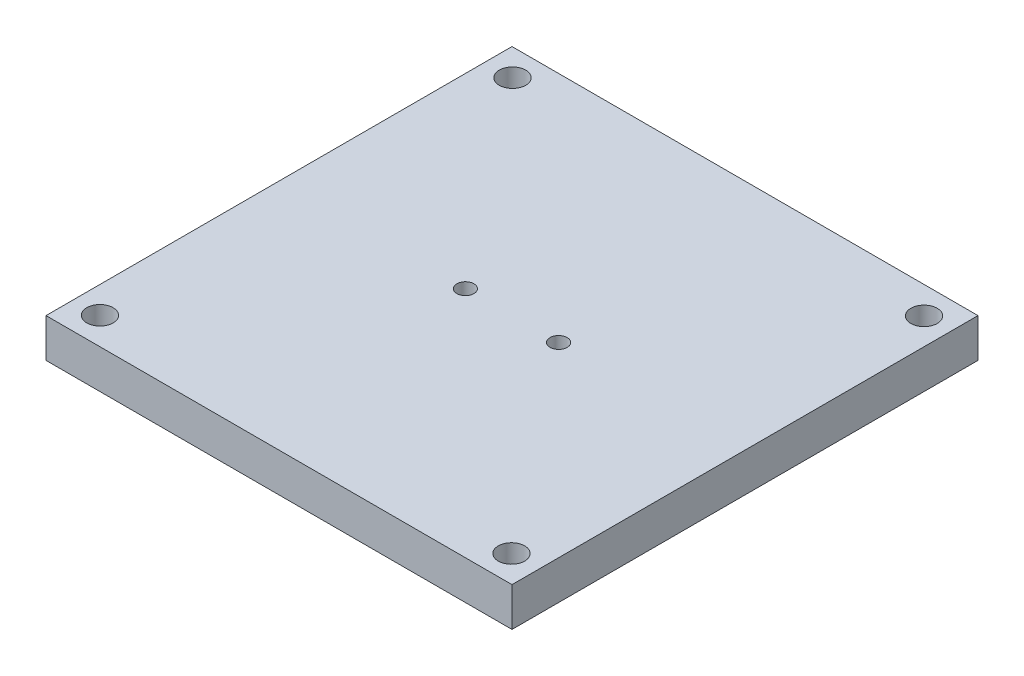
ISO-10303-21;
HEADER;
FILE_DESCRIPTION(('STEP AP214'),'2;1');
FILE_NAME('part.step','',(''),(''),'','','');
FILE_SCHEMA(('AUTOMOTIVE_DESIGN { 1 0 10303 214 1 1 1 1 }'));
ENDSEC;
DATA;
#1=APPLICATION_CONTEXT('core data for automotive mechanical design processes');
#2=APPLICATION_PROTOCOL_DEFINITION('international standard','automotive_design',2000,#1);
#3=PRODUCT_CONTEXT('',#1,'mechanical');
#4=PRODUCT('Part','Part','',(#3));
#5=PRODUCT_RELATED_PRODUCT_CATEGORY('part','',(#4));
#6=PRODUCT_DEFINITION_FORMATION('','',#4);
#7=PRODUCT_DEFINITION_CONTEXT('part definition',#1,'design');
#8=PRODUCT_DEFINITION('design','',#6,#7);
#9=PRODUCT_DEFINITION_SHAPE('','',#8);
#10=(LENGTH_UNIT() NAMED_UNIT(*) SI_UNIT(.MILLI.,.METRE.));
#11=(NAMED_UNIT(*) PLANE_ANGLE_UNIT() SI_UNIT($,.RADIAN.));
#12=(NAMED_UNIT(*) SI_UNIT($,.STERADIAN.) SOLID_ANGLE_UNIT());
#13=UNCERTAINTY_MEASURE_WITH_UNIT(LENGTH_MEASURE(1.E-05),#10,'distance_accuracy_value','');
#14=(GEOMETRIC_REPRESENTATION_CONTEXT(3) GLOBAL_UNCERTAINTY_ASSIGNED_CONTEXT((#13)) GLOBAL_UNIT_ASSIGNED_CONTEXT((#10,
#11,#12)) REPRESENTATION_CONTEXT('',''));
#15=CARTESIAN_POINT('',(0.,0.,0.));
#16=DIRECTION('',(0.,0.,1.));
#17=DIRECTION('',(1.,0.,0.));
#18=AXIS2_PLACEMENT_3D('',#15,#16,#17);
#19=CARTESIAN_POINT('',(0.,5.,0.));
#20=DIRECTION('',(0.,-1.,0.));
#21=DIRECTION('',(0.,0.,-1.));
#22=AXIS2_PLACEMENT_3D('',#19,#20,#21);
#23=PLANE('',#22);
#24=DIRECTION('',(0.,0.,1.));
#25=VECTOR('',#24,1.);
#26=CARTESIAN_POINT('',(0.,5.,0.));
#27=LINE('',#26,#25);
#28=CARTESIAN_POINT('',(0.,5.,-60.));
#29=VERTEX_POINT('',#28);
#30=CARTESIAN_POINT('',(0.,5.,0.));
#31=VERTEX_POINT('',#30);
#32=EDGE_CURVE('E93',#29,#31,#27,.T.);
#33=ORIENTED_EDGE('',*,*,#32,.T.);
#34=DIRECTION('',(1.,0.,0.));
#35=VECTOR('',#34,1.);
#36=CARTESIAN_POINT('',(0.,5.,0.));
#37=LINE('',#36,#35);
#38=CARTESIAN_POINT('',(60.,5.,0.));
#39=VERTEX_POINT('',#38);
#40=EDGE_CURVE('E88',#31,#39,#37,.T.);
#41=ORIENTED_EDGE('',*,*,#40,.T.);
#42=DIRECTION('',(0.,0.,-1.));
#43=VECTOR('',#42,1.);
#44=CARTESIAN_POINT('',(60.,5.,0.));
#45=LINE('',#44,#43);
#46=CARTESIAN_POINT('',(60.,5.,-60.));
#47=VERTEX_POINT('',#46);
#48=EDGE_CURVE('E91',#39,#47,#45,.T.);
#49=ORIENTED_EDGE('',*,*,#48,.T.);
#50=DIRECTION('',(-1.,0.,0.));
#51=VECTOR('',#50,1.);
#52=CARTESIAN_POINT('',(0.,5.,-60.));
#53=LINE('',#52,#51);
#54=EDGE_CURVE('E58',#47,#29,#53,.T.);
#55=ORIENTED_EDGE('',*,*,#54,.T.);
#56=EDGE_LOOP('',(#33,#41,#49,#55));
#57=FACE_BOUND('',#56,.T.);
#58=CARTESIAN_POINT('',(36.,5.,-30.));
#59=DIRECTION('',(0.,1.,0.));
#60=DIRECTION('',(0.,0.,1.));
#61=AXIS2_PLACEMENT_3D('',#58,#59,#60);
#62=CIRCLE('',#61,1.1);
#63=CARTESIAN_POINT('',(36.,5.,-28.9));
#64=VERTEX_POINT('',#63);
#65=EDGE_CURVE('E108',#64,#64,#62,.T.);
#66=ORIENTED_EDGE('',*,*,#65,.F.);
#67=EDGE_LOOP('',(#66));
#68=FACE_BOUND('',#67,.T.);
#69=CARTESIAN_POINT('',(24.,5.,-30.));
#70=DIRECTION('',(0.,1.,0.));
#71=DIRECTION('',(0.,0.,-1.));
#72=AXIS2_PLACEMENT_3D('',#69,#70,#71);
#73=CIRCLE('',#72,1.1);
#74=CARTESIAN_POINT('',(24.,5.,-31.1));
#75=VERTEX_POINT('',#74);
#76=EDGE_CURVE('E123',#75,#75,#73,.T.);
#77=ORIENTED_EDGE('',*,*,#76,.F.);
#78=EDGE_LOOP('',(#77));
#79=FACE_BOUND('',#78,.T.);
#80=CARTESIAN_POINT('',(3.50530286820927,5.,-56.5602431527652));
#81=DIRECTION('',(0.,1.,0.));
#82=DIRECTION('',(0.,0.,1.));
#83=AXIS2_PLACEMENT_3D('',#80,#81,#82);
#84=CIRCLE('',#83,1.7);
#85=CARTESIAN_POINT('',(3.50530286820927,5.,-54.8602431527652));
#86=VERTEX_POINT('',#85);
#87=EDGE_CURVE('E129',#86,#86,#84,.T.);
#88=ORIENTED_EDGE('',*,*,#87,.F.);
#89=EDGE_LOOP('',(#88));
#90=FACE_BOUND('',#89,.T.);
#91=CARTESIAN_POINT('',(56.5602431527653,5.,-56.4946971317914));
#92=DIRECTION('',(0.,1.,0.));
#93=DIRECTION('',(0.,0.,1.));
#94=AXIS2_PLACEMENT_3D('',#91,#92,#93);
#95=CIRCLE('',#94,1.7);
#96=CARTESIAN_POINT('',(56.5602431527653,5.,-54.7946971317914));
#97=VERTEX_POINT('',#96);
#98=EDGE_CURVE('E135',#97,#97,#95,.T.);
#99=ORIENTED_EDGE('',*,*,#98,.F.);
#100=EDGE_LOOP('',(#99));
#101=FACE_BOUND('',#100,.T.);
#102=CARTESIAN_POINT('',(56.4946971317913,5.,-3.43975684723538));
#103=DIRECTION('',(0.,1.,0.));
#104=DIRECTION('',(0.,0.,1.));
#105=AXIS2_PLACEMENT_3D('',#102,#103,#104);
#106=CIRCLE('',#105,1.7);
#107=CARTESIAN_POINT('',(56.4946971317913,5.,-1.73975684723538));
#108=VERTEX_POINT('',#107);
#109=EDGE_CURVE('E141',#108,#108,#106,.T.);
#110=ORIENTED_EDGE('',*,*,#109,.F.);
#111=EDGE_LOOP('',(#110));
#112=FACE_BOUND('',#111,.T.);
#113=CARTESIAN_POINT('',(3.43975684723528,5.,-3.50530286820955));
#114=DIRECTION('',(0.,1.,0.));
#115=DIRECTION('',(0.,0.,1.));
#116=AXIS2_PLACEMENT_3D('',#113,#114,#115);
#117=CIRCLE('',#116,1.7);
#118=CARTESIAN_POINT('',(3.43975684723528,5.,-1.80530286820955));
#119=VERTEX_POINT('',#118);
#120=EDGE_CURVE('E147',#119,#119,#117,.T.);
#121=ORIENTED_EDGE('',*,*,#120,.F.);
#122=EDGE_LOOP('',(#121));
#123=FACE_BOUND('',#122,.T.);
#124=ADVANCED_FACE('F41',(#57,#68,#79,#90,#101,#112,#123),#23,.F.);
#125=CARTESIAN_POINT('',(0.,0.,0.));
#126=DIRECTION('',(0.,-1.,0.));
#127=DIRECTION('',(0.,0.,-1.));
#128=AXIS2_PLACEMENT_3D('',#125,#126,#127);
#129=PLANE('',#128);
#130=CARTESIAN_POINT('',(56.4946971317913,0.,-3.43975684723538));
#131=DIRECTION('',(0.,1.,0.));
#132=DIRECTION('',(0.,0.,1.));
#133=AXIS2_PLACEMENT_3D('',#130,#131,#132);
#134=CIRCLE('',#133,1.7);
#135=CARTESIAN_POINT('',(56.4946971317913,0.,-1.73975684723538));
#136=VERTEX_POINT('',#135);
#137=EDGE_CURVE('E144',#136,#136,#134,.T.);
#138=ORIENTED_EDGE('',*,*,#137,.T.);
#139=EDGE_LOOP('',(#138));
#140=FACE_BOUND('',#139,.T.);
#141=CARTESIAN_POINT('',(3.50530286820927,0.,-56.5602431527652));
#142=DIRECTION('',(0.,1.,0.));
#143=DIRECTION('',(0.,0.,1.));
#144=AXIS2_PLACEMENT_3D('',#141,#142,#143);
#145=CIRCLE('',#144,1.7);
#146=CARTESIAN_POINT('',(3.50530286820927,0.,-54.8602431527652));
#147=VERTEX_POINT('',#146);
#148=EDGE_CURVE('E132',#147,#147,#145,.T.);
#149=ORIENTED_EDGE('',*,*,#148,.T.);
#150=EDGE_LOOP('',(#149));
#151=FACE_BOUND('',#150,.T.);
#152=CARTESIAN_POINT('',(36.,0.,-30.));
#153=DIRECTION('',(0.,1.,0.));
#154=DIRECTION('',(0.,0.,1.));
#155=AXIS2_PLACEMENT_3D('',#152,#153,#154);
#156=CIRCLE('',#155,1.1);
#157=CARTESIAN_POINT('',(36.,0.,-28.9));
#158=VERTEX_POINT('',#157);
#159=EDGE_CURVE('E120',#158,#158,#156,.T.);
#160=ORIENTED_EDGE('',*,*,#159,.T.);
#161=EDGE_LOOP('',(#160));
#162=FACE_BOUND('',#161,.T.);
#163=DIRECTION('',(0.,0.,1.));
#164=VECTOR('',#163,1.);
#165=CARTESIAN_POINT('',(0.,0.,0.));
#166=LINE('',#165,#164);
#167=CARTESIAN_POINT('',(0.,0.,-60.));
#168=VERTEX_POINT('',#167);
#169=CARTESIAN_POINT('',(0.,0.,0.));
#170=VERTEX_POINT('',#169);
#171=EDGE_CURVE('E105',#168,#170,#166,.T.);
#172=ORIENTED_EDGE('',*,*,#171,.F.);
#173=DIRECTION('',(-1.,0.,0.));
#174=VECTOR('',#173,1.);
#175=CARTESIAN_POINT('',(0.,0.,-60.));
#176=LINE('',#175,#174);
#177=CARTESIAN_POINT('',(60.,0.,-60.));
#178=VERTEX_POINT('',#177);
#179=EDGE_CURVE('E81',#178,#168,#176,.T.);
#180=ORIENTED_EDGE('',*,*,#179,.F.);
#181=DIRECTION('',(0.,0.,-1.));
#182=VECTOR('',#181,1.);
#183=CARTESIAN_POINT('',(60.,0.,0.));
#184=LINE('',#183,#182);
#185=CARTESIAN_POINT('',(60.,0.,0.));
#186=VERTEX_POINT('',#185);
#187=EDGE_CURVE('E75',#186,#178,#184,.T.);
#188=ORIENTED_EDGE('',*,*,#187,.F.);
#189=DIRECTION('',(1.,0.,0.));
#190=VECTOR('',#189,1.);
#191=CARTESIAN_POINT('',(0.,0.,0.));
#192=LINE('',#191,#190);
#193=EDGE_CURVE('E97',#170,#186,#192,.T.);
#194=ORIENTED_EDGE('',*,*,#193,.F.);
#195=EDGE_LOOP('',(#172,#180,#188,#194));
#196=FACE_BOUND('',#195,.T.);
#197=CARTESIAN_POINT('',(24.,0.,-30.));
#198=DIRECTION('',(0.,1.,0.));
#199=DIRECTION('',(0.,0.,-1.));
#200=AXIS2_PLACEMENT_3D('',#197,#198,#199);
#201=CIRCLE('',#200,1.1);
#202=CARTESIAN_POINT('',(24.,0.,-31.1));
#203=VERTEX_POINT('',#202);
#204=EDGE_CURVE('E126',#203,#203,#201,.T.);
#205=ORIENTED_EDGE('',*,*,#204,.T.);
#206=EDGE_LOOP('',(#205));
#207=FACE_BOUND('',#206,.T.);
#208=CARTESIAN_POINT('',(56.5602431527653,0.,-56.4946971317914));
#209=DIRECTION('',(0.,1.,0.));
#210=DIRECTION('',(0.,0.,1.));
#211=AXIS2_PLACEMENT_3D('',#208,#209,#210);
#212=CIRCLE('',#211,1.7);
#213=CARTESIAN_POINT('',(56.5602431527653,0.,-54.7946971317914));
#214=VERTEX_POINT('',#213);
#215=EDGE_CURVE('E138',#214,#214,#212,.T.);
#216=ORIENTED_EDGE('',*,*,#215,.T.);
#217=EDGE_LOOP('',(#216));
#218=FACE_BOUND('',#217,.T.);
#219=CARTESIAN_POINT('',(3.43975684723528,0.,-3.50530286820955));
#220=DIRECTION('',(0.,1.,0.));
#221=DIRECTION('',(0.,0.,1.));
#222=AXIS2_PLACEMENT_3D('',#219,#220,#221);
#223=CIRCLE('',#222,1.7);
#224=CARTESIAN_POINT('',(3.43975684723528,0.,-1.80530286820955));
#225=VERTEX_POINT('',#224);
#226=EDGE_CURVE('E150',#225,#225,#223,.T.);
#227=ORIENTED_EDGE('',*,*,#226,.T.);
#228=EDGE_LOOP('',(#227));
#229=FACE_BOUND('',#228,.T.);
#230=ADVANCED_FACE('F116',(#140,#151,#162,#196,#207,#218,#229),#129,.T.);
#231=CARTESIAN_POINT('',(0.,5.,0.));
#232=DIRECTION('',(1.,0.,0.));
#233=DIRECTION('',(0.,0.,-1.));
#234=AXIS2_PLACEMENT_3D('',#231,#232,#233);
#235=PLANE('',#234);
#236=ORIENTED_EDGE('',*,*,#171,.T.);
#237=DIRECTION('',(0.,-1.,0.));
#238=VECTOR('',#237,1.);
#239=CARTESIAN_POINT('',(0.,5.,0.));
#240=LINE('',#239,#238);
#241=EDGE_CURVE('E11',#31,#170,#240,.T.);
#242=ORIENTED_EDGE('',*,*,#241,.F.);
#243=ORIENTED_EDGE('',*,*,#32,.F.);
#244=DIRECTION('',(0.,-1.,0.));
#245=VECTOR('',#244,1.);
#246=CARTESIAN_POINT('',(0.,5.,-60.));
#247=LINE('',#246,#245);
#248=EDGE_CURVE('E101',#29,#168,#247,.T.);
#249=ORIENTED_EDGE('',*,*,#248,.T.);
#250=EDGE_LOOP('',(#236,#242,#243,#249));
#251=FACE_BOUND('',#250,.T.);
#252=ADVANCED_FACE('F43',(#251),#235,.F.);
#253=CARTESIAN_POINT('',(0.,5.,0.));
#254=DIRECTION('',(0.,0.,-1.));
#255=DIRECTION('',(-1.,0.,0.));
#256=AXIS2_PLACEMENT_3D('',#253,#254,#255);
#257=PLANE('',#256);
#258=ORIENTED_EDGE('',*,*,#193,.T.);
#259=DIRECTION('',(0.,-1.,0.));
#260=VECTOR('',#259,1.);
#261=CARTESIAN_POINT('',(60.,5.,0.));
#262=LINE('',#261,#260);
#263=EDGE_CURVE('E50',#39,#186,#262,.T.);
#264=ORIENTED_EDGE('',*,*,#263,.F.);
#265=ORIENTED_EDGE('',*,*,#40,.F.);
#266=ORIENTED_EDGE('',*,*,#241,.T.);
#267=EDGE_LOOP('',(#258,#264,#265,#266));
#268=FACE_BOUND('',#267,.T.);
#269=ADVANCED_FACE('F96',(#268),#257,.F.);
#270=CARTESIAN_POINT('',(60.,5.,0.));
#271=DIRECTION('',(-1.,0.,0.));
#272=DIRECTION('',(0.,0.,1.));
#273=AXIS2_PLACEMENT_3D('',#270,#271,#272);
#274=PLANE('',#273);
#275=ORIENTED_EDGE('',*,*,#187,.T.);
#276=DIRECTION('',(0.,-1.,0.));
#277=VECTOR('',#276,1.);
#278=CARTESIAN_POINT('',(60.,5.,-60.));
#279=LINE('',#278,#277);
#280=EDGE_CURVE('E98',#47,#178,#279,.T.);
#281=ORIENTED_EDGE('',*,*,#280,.F.);
#282=ORIENTED_EDGE('',*,*,#48,.F.);
#283=ORIENTED_EDGE('',*,*,#263,.T.);
#284=EDGE_LOOP('',(#275,#281,#282,#283));
#285=FACE_BOUND('',#284,.T.);
#286=ADVANCED_FACE('F99',(#285),#274,.F.);
#287=CARTESIAN_POINT('',(0.,5.,-60.));
#288=DIRECTION('',(0.,0.,1.));
#289=DIRECTION('',(1.,0.,0.));
#290=AXIS2_PLACEMENT_3D('',#287,#288,#289);
#291=PLANE('',#290);
#292=ORIENTED_EDGE('',*,*,#179,.T.);
#293=ORIENTED_EDGE('',*,*,#248,.F.);
#294=ORIENTED_EDGE('',*,*,#54,.F.);
#295=ORIENTED_EDGE('',*,*,#280,.T.);
#296=EDGE_LOOP('',(#292,#293,#294,#295));
#297=FACE_BOUND('',#296,.T.);
#298=ADVANCED_FACE('F113',(#297),#291,.F.);
#299=CARTESIAN_POINT('',(36.,5.,-30.));
#300=DIRECTION('',(0.,-1.,0.));
#301=DIRECTION('',(0.,0.,-1.));
#302=AXIS2_PLACEMENT_3D('',#299,#300,#301);
#303=CYLINDRICAL_SURFACE('',#302,1.1);
#304=ORIENTED_EDGE('',*,*,#65,.T.);
#305=EDGE_LOOP('',(#304));
#306=FACE_BOUND('',#305,.T.);
#307=ORIENTED_EDGE('',*,*,#159,.F.);
#308=EDGE_LOOP('',(#307));
#309=FACE_BOUND('',#308,.T.);
#310=ADVANCED_FACE('F167',(#306,#309),#303,.F.);
#311=CARTESIAN_POINT('',(24.,5.,-30.));
#312=DIRECTION('',(0.,-1.,0.));
#313=DIRECTION('',(0.,0.,-1.));
#314=AXIS2_PLACEMENT_3D('',#311,#312,#313);
#315=CYLINDRICAL_SURFACE('',#314,1.1);
#316=ORIENTED_EDGE('',*,*,#76,.T.);
#317=EDGE_LOOP('',(#316));
#318=FACE_BOUND('',#317,.T.);
#319=ORIENTED_EDGE('',*,*,#204,.F.);
#320=EDGE_LOOP('',(#319));
#321=FACE_BOUND('',#320,.T.);
#322=ADVANCED_FACE('F212',(#318,#321),#315,.F.);
#323=CARTESIAN_POINT('',(3.50530286820927,5.,-56.5602431527652));
#324=DIRECTION('',(0.,-1.,0.));
#325=DIRECTION('',(0.,0.,-1.));
#326=AXIS2_PLACEMENT_3D('',#323,#324,#325);
#327=CYLINDRICAL_SURFACE('',#326,1.7);
#328=ORIENTED_EDGE('',*,*,#87,.T.);
#329=EDGE_LOOP('',(#328));
#330=FACE_BOUND('',#329,.T.);
#331=ORIENTED_EDGE('',*,*,#148,.F.);
#332=EDGE_LOOP('',(#331));
#333=FACE_BOUND('',#332,.T.);
#334=ADVANCED_FACE('F220',(#330,#333),#327,.F.);
#335=CARTESIAN_POINT('',(56.5602431527653,5.,-56.4946971317914));
#336=DIRECTION('',(0.,-1.,0.));
#337=DIRECTION('',(0.,0.,-1.));
#338=AXIS2_PLACEMENT_3D('',#335,#336,#337);
#339=CYLINDRICAL_SURFACE('',#338,1.7);
#340=ORIENTED_EDGE('',*,*,#98,.T.);
#341=EDGE_LOOP('',(#340));
#342=FACE_BOUND('',#341,.T.);
#343=ORIENTED_EDGE('',*,*,#215,.F.);
#344=EDGE_LOOP('',(#343));
#345=FACE_BOUND('',#344,.T.);
#346=ADVANCED_FACE('F228',(#342,#345),#339,.F.);
#347=CARTESIAN_POINT('',(56.4946971317913,5.,-3.43975684723538));
#348=DIRECTION('',(0.,-1.,0.));
#349=DIRECTION('',(0.,0.,-1.));
#350=AXIS2_PLACEMENT_3D('',#347,#348,#349);
#351=CYLINDRICAL_SURFACE('',#350,1.7);
#352=ORIENTED_EDGE('',*,*,#109,.T.);
#353=EDGE_LOOP('',(#352));
#354=FACE_BOUND('',#353,.T.);
#355=ORIENTED_EDGE('',*,*,#137,.F.);
#356=EDGE_LOOP('',(#355));
#357=FACE_BOUND('',#356,.T.);
#358=ADVANCED_FACE('F237',(#354,#357),#351,.F.);
#359=CARTESIAN_POINT('',(3.43975684723528,5.,-3.50530286820955));
#360=DIRECTION('',(0.,-1.,0.));
#361=DIRECTION('',(0.,0.,-1.));
#362=AXIS2_PLACEMENT_3D('',#359,#360,#361);
#363=CYLINDRICAL_SURFACE('',#362,1.7);
#364=ORIENTED_EDGE('',*,*,#120,.T.);
#365=EDGE_LOOP('',(#364));
#366=FACE_BOUND('',#365,.T.);
#367=ORIENTED_EDGE('',*,*,#226,.F.);
#368=EDGE_LOOP('',(#367));
#369=FACE_BOUND('',#368,.T.);
#370=ADVANCED_FACE('F156',(#366,#369),#363,.F.);
#371=CLOSED_SHELL('',(#124,#230,#252,#269,#286,#298,#310,#322,#334,#346,#358,#370));
#372=MANIFOLD_SOLID_BREP('B2',#371);
#373=ADVANCED_BREP_SHAPE_REPRESENTATION('',(#18,#372),#14);
#374=SHAPE_DEFINITION_REPRESENTATION(#9,#373);
ENDSEC;
END-ISO-10303-21;
